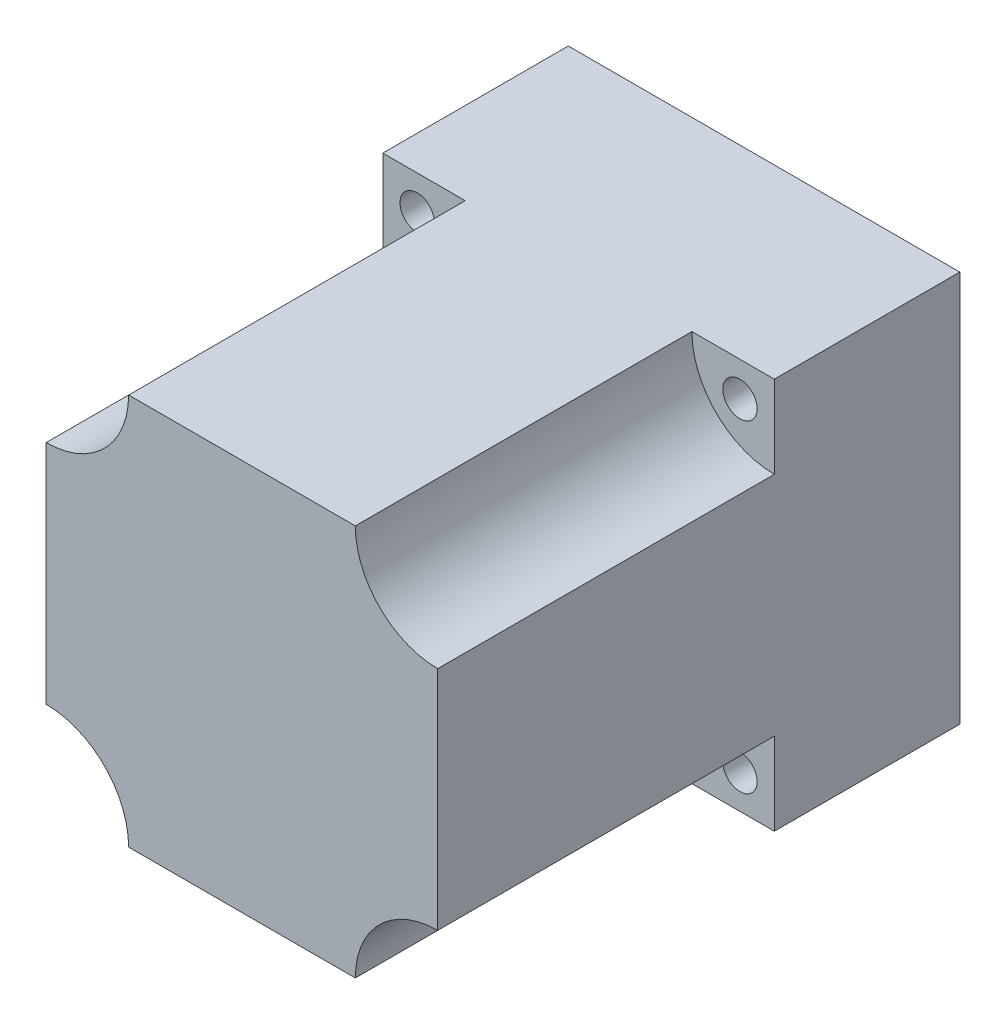
ISO-10303-21;
HEADER;
FILE_DESCRIPTION(('STEP AP214'),'2;1');
FILE_NAME('part.step','',(''),(''),'','','');
FILE_SCHEMA(('AUTOMOTIVE_DESIGN { 1 0 10303 214 1 1 1 1 }'));
ENDSEC;
DATA;
#1=APPLICATION_CONTEXT('core data for automotive mechanical design processes');
#2=APPLICATION_PROTOCOL_DEFINITION('international standard','automotive_design',2000,#1);
#3=PRODUCT_CONTEXT('',#1,'mechanical');
#4=PRODUCT('Part','Part','',(#3));
#5=PRODUCT_RELATED_PRODUCT_CATEGORY('part','',(#4));
#6=PRODUCT_DEFINITION_FORMATION('','',#4);
#7=PRODUCT_DEFINITION_CONTEXT('part definition',#1,'design');
#8=PRODUCT_DEFINITION('design','',#6,#7);
#9=PRODUCT_DEFINITION_SHAPE('','',#8);
#10=(LENGTH_UNIT() NAMED_UNIT(*) SI_UNIT(.MILLI.,.METRE.));
#11=(NAMED_UNIT(*) PLANE_ANGLE_UNIT() SI_UNIT($,.RADIAN.));
#12=(NAMED_UNIT(*) SI_UNIT($,.STERADIAN.) SOLID_ANGLE_UNIT());
#13=UNCERTAINTY_MEASURE_WITH_UNIT(LENGTH_MEASURE(1.E-05),#10,'distance_accuracy_value','');
#14=(GEOMETRIC_REPRESENTATION_CONTEXT(3) GLOBAL_UNCERTAINTY_ASSIGNED_CONTEXT((#13)) GLOBAL_UNIT_ASSIGNED_CONTEXT((#10,
#11,#12)) REPRESENTATION_CONTEXT('',''));
#15=CARTESIAN_POINT('',(0.,0.,0.));
#16=DIRECTION('',(0.,0.,1.));
#17=DIRECTION('',(1.,0.,0.));
#18=AXIS2_PLACEMENT_3D('',#15,#16,#17);
#19=CARTESIAN_POINT('',(28.5,28.5,76.));
#20=DIRECTION('',(-1.,0.,0.));
#21=DIRECTION('',(0.,-1.,0.));
#22=AXIS2_PLACEMENT_3D('',#19,#20,#21);
#23=PLANE('',#22);
#24=DIRECTION('',(0.,1.,0.));
#25=VECTOR('',#24,1.);
#26=CARTESIAN_POINT('',(28.5,28.5,27.));
#27=LINE('',#26,#25);
#28=CARTESIAN_POINT('',(28.5,16.5,27.));
#29=VERTEX_POINT('',#28);
#30=CARTESIAN_POINT('',(28.5,28.5,27.));
#31=VERTEX_POINT('',#30);
#32=EDGE_CURVE('E225',#29,#31,#27,.T.);
#33=ORIENTED_EDGE('',*,*,#32,.F.);
#34=DIRECTION('',(0.,0.,1.));
#35=VECTOR('',#34,1.);
#36=CARTESIAN_POINT('',(28.5,16.5,27.));
#37=LINE('',#36,#35);
#38=CARTESIAN_POINT('',(28.5,16.5,76.));
#39=VERTEX_POINT('',#38);
#40=EDGE_CURVE('E216',#29,#39,#37,.T.);
#41=ORIENTED_EDGE('',*,*,#40,.T.);
#42=DIRECTION('',(0.,1.,0.));
#43=VECTOR('',#42,1.);
#44=CARTESIAN_POINT('',(28.5,28.5,76.));
#45=LINE('',#44,#43);
#46=CARTESIAN_POINT('',(28.5,-16.5,76.));
#47=VERTEX_POINT('',#46);
#48=EDGE_CURVE('E228',#47,#39,#45,.T.);
#49=ORIENTED_EDGE('',*,*,#48,.F.);
#50=DIRECTION('',(0.,0.,1.));
#51=VECTOR('',#50,1.);
#52=CARTESIAN_POINT('',(28.5,-16.5,27.));
#53=LINE('',#52,#51);
#54=CARTESIAN_POINT('',(28.5,-16.5,27.));
#55=VERTEX_POINT('',#54);
#56=EDGE_CURVE('E206',#47,#55,#53,.F.);
#57=ORIENTED_EDGE('',*,*,#56,.T.);
#58=DIRECTION('',(0.,1.,0.));
#59=VECTOR('',#58,1.);
#60=CARTESIAN_POINT('',(28.5,28.5,27.));
#61=LINE('',#60,#59);
#62=CARTESIAN_POINT('',(28.5,-28.5,27.));
#63=VERTEX_POINT('',#62);
#64=EDGE_CURVE('E219',#63,#55,#61,.T.);
#65=ORIENTED_EDGE('',*,*,#64,.F.);
#66=DIRECTION('',(0.,0.,-1.));
#67=VECTOR('',#66,1.);
#68=CARTESIAN_POINT('',(28.5,-28.5,76.));
#69=LINE('',#68,#67);
#70=CARTESIAN_POINT('',(28.5,-28.5,0.));
#71=VERTEX_POINT('',#70);
#72=EDGE_CURVE('E241',#63,#71,#69,.T.);
#73=ORIENTED_EDGE('',*,*,#72,.T.);
#74=DIRECTION('',(0.,1.,0.));
#75=VECTOR('',#74,1.);
#76=CARTESIAN_POINT('',(28.5,28.5,0.));
#77=LINE('',#76,#75);
#78=CARTESIAN_POINT('',(28.5,28.5,0.));
#79=VERTEX_POINT('',#78);
#80=EDGE_CURVE('E227',#71,#79,#77,.T.);
#81=ORIENTED_EDGE('',*,*,#80,.T.);
#82=DIRECTION('',(0.,0.,-1.));
#83=VECTOR('',#82,1.);
#84=CARTESIAN_POINT('',(28.5,28.5,76.));
#85=LINE('',#84,#83);
#86=EDGE_CURVE('E257',#31,#79,#85,.T.);
#87=ORIENTED_EDGE('',*,*,#86,.F.);
#88=EDGE_LOOP('',(#33,#41,#49,#57,#65,#73,#81,#87));
#89=FACE_BOUND('',#88,.T.);
#90=ADVANCED_FACE('F39',(#89),#23,.F.);
#91=CARTESIAN_POINT('',(-28.5,28.5,76.));
#92=DIRECTION('',(0.,-1.,0.));
#93=DIRECTION('',(0.,0.,-1.));
#94=AXIS2_PLACEMENT_3D('',#91,#92,#93);
#95=PLANE('',#94);
#96=DIRECTION('',(-1.,0.,0.));
#97=VECTOR('',#96,1.);
#98=CARTESIAN_POINT('',(-28.5,28.5,76.));
#99=LINE('',#98,#97);
#100=CARTESIAN_POINT('',(16.5,28.5,76.));
#101=VERTEX_POINT('',#100);
#102=CARTESIAN_POINT('',(-16.5,28.5,76.));
#103=VERTEX_POINT('',#102);
#104=EDGE_CURVE('E231',#101,#103,#99,.T.);
#105=ORIENTED_EDGE('',*,*,#104,.F.);
#106=DIRECTION('',(0.,0.,1.));
#107=VECTOR('',#106,1.);
#108=CARTESIAN_POINT('',(16.5,28.5,27.));
#109=LINE('',#108,#107);
#110=CARTESIAN_POINT('',(16.5,28.5,27.));
#111=VERTEX_POINT('',#110);
#112=EDGE_CURVE('E213',#101,#111,#109,.F.);
#113=ORIENTED_EDGE('',*,*,#112,.T.);
#114=DIRECTION('',(-1.,0.,0.));
#115=VECTOR('',#114,1.);
#116=CARTESIAN_POINT('',(-28.5,28.5,27.));
#117=LINE('',#116,#115);
#118=EDGE_CURVE('E165',#31,#111,#117,.T.);
#119=ORIENTED_EDGE('',*,*,#118,.F.);
#120=ORIENTED_EDGE('',*,*,#86,.T.);
#121=DIRECTION('',(-1.,0.,0.));
#122=VECTOR('',#121,1.);
#123=CARTESIAN_POINT('',(-28.5,28.5,0.));
#124=LINE('',#123,#122);
#125=CARTESIAN_POINT('',(-28.5,28.5,0.));
#126=VERTEX_POINT('',#125);
#127=EDGE_CURVE('E244',#79,#126,#124,.T.);
#128=ORIENTED_EDGE('',*,*,#127,.T.);
#129=DIRECTION('',(0.,0.,-1.));
#130=VECTOR('',#129,1.);
#131=CARTESIAN_POINT('',(-28.5,28.5,76.));
#132=LINE('',#131,#130);
#133=CARTESIAN_POINT('',(-28.5,28.5,27.));
#134=VERTEX_POINT('',#133);
#135=EDGE_CURVE('E255',#134,#126,#132,.T.);
#136=ORIENTED_EDGE('',*,*,#135,.F.);
#137=DIRECTION('',(-1.,0.,0.));
#138=VECTOR('',#137,1.);
#139=CARTESIAN_POINT('',(-28.5,28.5,27.));
#140=LINE('',#139,#138);
#141=CARTESIAN_POINT('',(-16.5,28.5,27.));
#142=VERTEX_POINT('',#141);
#143=EDGE_CURVE('E223',#142,#134,#140,.T.);
#144=ORIENTED_EDGE('',*,*,#143,.F.);
#145=DIRECTION('',(0.,0.,1.));
#146=VECTOR('',#145,1.);
#147=CARTESIAN_POINT('',(-16.5,28.5,27.));
#148=LINE('',#147,#146);
#149=EDGE_CURVE('E200',#142,#103,#148,.T.);
#150=ORIENTED_EDGE('',*,*,#149,.T.);
#151=EDGE_LOOP('',(#105,#113,#119,#120,#128,#136,#144,#150));
#152=FACE_BOUND('',#151,.T.);
#153=ADVANCED_FACE('F298',(#152),#95,.F.);
#154=CARTESIAN_POINT('',(-28.5,28.5,76.));
#155=DIRECTION('',(1.,0.,0.));
#156=DIRECTION('',(0.,1.,0.));
#157=AXIS2_PLACEMENT_3D('',#154,#155,#156);
#158=PLANE('',#157);
#159=DIRECTION('',(0.,-1.,0.));
#160=VECTOR('',#159,1.);
#161=CARTESIAN_POINT('',(-28.5,28.5,27.));
#162=LINE('',#161,#160);
#163=CARTESIAN_POINT('',(-28.5,-16.5,27.));
#164=VERTEX_POINT('',#163);
#165=CARTESIAN_POINT('',(-28.5,-28.5,27.));
#166=VERTEX_POINT('',#165);
#167=EDGE_CURVE('E221',#164,#166,#162,.T.);
#168=ORIENTED_EDGE('',*,*,#167,.F.);
#169=DIRECTION('',(0.,0.,1.));
#170=VECTOR('',#169,1.);
#171=CARTESIAN_POINT('',(-28.5,-16.5,27.));
#172=LINE('',#171,#170);
#173=CARTESIAN_POINT('',(-28.5,-16.5,76.));
#174=VERTEX_POINT('',#173);
#175=EDGE_CURVE('E210',#164,#174,#172,.T.);
#176=ORIENTED_EDGE('',*,*,#175,.T.);
#177=DIRECTION('',(0.,-1.,0.));
#178=VECTOR('',#177,1.);
#179=CARTESIAN_POINT('',(-28.5,28.5,76.));
#180=LINE('',#179,#178);
#181=CARTESIAN_POINT('',(-28.5,16.5,76.));
#182=VERTEX_POINT('',#181);
#183=EDGE_CURVE('E235',#182,#174,#180,.T.);
#184=ORIENTED_EDGE('',*,*,#183,.F.);
#185=DIRECTION('',(0.,0.,1.));
#186=VECTOR('',#185,1.);
#187=CARTESIAN_POINT('',(-28.5,16.5,27.));
#188=LINE('',#187,#186);
#189=CARTESIAN_POINT('',(-28.5,16.5,27.));
#190=VERTEX_POINT('',#189);
#191=EDGE_CURVE('E197',#182,#190,#188,.F.);
#192=ORIENTED_EDGE('',*,*,#191,.T.);
#193=DIRECTION('',(0.,-1.,0.));
#194=VECTOR('',#193,1.);
#195=CARTESIAN_POINT('',(-28.5,28.5,27.));
#196=LINE('',#195,#194);
#197=EDGE_CURVE('E265',#134,#190,#196,.T.);
#198=ORIENTED_EDGE('',*,*,#197,.F.);
#199=ORIENTED_EDGE('',*,*,#135,.T.);
#200=DIRECTION('',(0.,-1.,0.));
#201=VECTOR('',#200,1.);
#202=CARTESIAN_POINT('',(-28.5,28.5,0.));
#203=LINE('',#202,#201);
#204=CARTESIAN_POINT('',(-28.5,-28.5,0.));
#205=VERTEX_POINT('',#204);
#206=EDGE_CURVE('E247',#126,#205,#203,.T.);
#207=ORIENTED_EDGE('',*,*,#206,.T.);
#208=DIRECTION('',(0.,0.,-1.));
#209=VECTOR('',#208,1.);
#210=CARTESIAN_POINT('',(-28.5,-28.5,76.));
#211=LINE('',#210,#209);
#212=EDGE_CURVE('E253',#166,#205,#211,.T.);
#213=ORIENTED_EDGE('',*,*,#212,.F.);
#214=EDGE_LOOP('',(#168,#176,#184,#192,#198,#199,#207,#213));
#215=FACE_BOUND('',#214,.T.);
#216=ADVANCED_FACE('F295',(#215),#158,.F.);
#217=CARTESIAN_POINT('',(-28.5,-28.5,76.));
#218=DIRECTION('',(0.,1.,0.));
#219=DIRECTION('',(0.,0.,1.));
#220=AXIS2_PLACEMENT_3D('',#217,#218,#219);
#221=PLANE('',#220);
#222=DIRECTION('',(1.,0.,0.));
#223=VECTOR('',#222,1.);
#224=CARTESIAN_POINT('',(-28.5,-28.5,76.));
#225=LINE('',#224,#223);
#226=CARTESIAN_POINT('',(-16.5,-28.5,76.));
#227=VERTEX_POINT('',#226);
#228=CARTESIAN_POINT('',(16.5,-28.5,76.));
#229=VERTEX_POINT('',#228);
#230=EDGE_CURVE('E238',#227,#229,#225,.T.);
#231=ORIENTED_EDGE('',*,*,#230,.F.);
#232=DIRECTION('',(0.,0.,1.));
#233=VECTOR('',#232,1.);
#234=CARTESIAN_POINT('',(-16.5,-28.5,27.));
#235=LINE('',#234,#233);
#236=CARTESIAN_POINT('',(-16.5,-28.5,27.));
#237=VERTEX_POINT('',#236);
#238=EDGE_CURVE('E61',#227,#237,#235,.F.);
#239=ORIENTED_EDGE('',*,*,#238,.T.);
#240=DIRECTION('',(1.,0.,0.));
#241=VECTOR('',#240,1.);
#242=CARTESIAN_POINT('',(-28.5,-28.5,27.));
#243=LINE('',#242,#241);
#244=EDGE_CURVE('E263',#166,#237,#243,.T.);
#245=ORIENTED_EDGE('',*,*,#244,.F.);
#246=ORIENTED_EDGE('',*,*,#212,.T.);
#247=DIRECTION('',(1.,0.,0.));
#248=VECTOR('',#247,1.);
#249=CARTESIAN_POINT('',(-28.5,-28.5,0.));
#250=LINE('',#249,#248);
#251=EDGE_CURVE('E232',#205,#71,#250,.T.);
#252=ORIENTED_EDGE('',*,*,#251,.T.);
#253=ORIENTED_EDGE('',*,*,#72,.F.);
#254=DIRECTION('',(1.,0.,0.));
#255=VECTOR('',#254,1.);
#256=CARTESIAN_POINT('',(-28.5,-28.5,27.));
#257=LINE('',#256,#255);
#258=CARTESIAN_POINT('',(16.5,-28.5,27.));
#259=VERTEX_POINT('',#258);
#260=EDGE_CURVE('E261',#259,#63,#257,.T.);
#261=ORIENTED_EDGE('',*,*,#260,.F.);
#262=DIRECTION('',(0.,0.,1.));
#263=VECTOR('',#262,1.);
#264=CARTESIAN_POINT('',(16.5,-28.5,27.));
#265=LINE('',#264,#263);
#266=EDGE_CURVE('E203',#259,#229,#265,.T.);
#267=ORIENTED_EDGE('',*,*,#266,.T.);
#268=EDGE_LOOP('',(#231,#239,#245,#246,#252,#253,#261,#267));
#269=FACE_BOUND('',#268,.T.);
#270=ADVANCED_FACE('F310',(#269),#221,.F.);
#271=CARTESIAN_POINT('',(0.,0.,76.));
#272=DIRECTION('',(0.,0.,1.));
#273=DIRECTION('',(1.,0.,0.));
#274=AXIS2_PLACEMENT_3D('',#271,#272,#273);
#275=PLANE('',#274);
#276=CARTESIAN_POINT('',(28.5,28.5,76.));
#277=DIRECTION('',(0.,0.,1.));
#278=DIRECTION('',(1.,0.,0.));
#279=AXIS2_PLACEMENT_3D('',#276,#277,#278);
#280=CIRCLE('',#279,12.);
#281=EDGE_CURVE('E185',#101,#39,#280,.T.);
#282=ORIENTED_EDGE('',*,*,#281,.F.);
#283=ORIENTED_EDGE('',*,*,#104,.T.);
#284=CARTESIAN_POINT('',(-28.5,28.5,76.));
#285=DIRECTION('',(0.,0.,1.));
#286=DIRECTION('',(1.,0.,0.));
#287=AXIS2_PLACEMENT_3D('',#284,#285,#286);
#288=CIRCLE('',#287,12.);
#289=EDGE_CURVE('E259',#182,#103,#288,.T.);
#290=ORIENTED_EDGE('',*,*,#289,.F.);
#291=ORIENTED_EDGE('',*,*,#183,.T.);
#292=CARTESIAN_POINT('',(-28.5,-28.5,76.));
#293=DIRECTION('',(0.,0.,1.));
#294=DIRECTION('',(1.,0.,0.));
#295=AXIS2_PLACEMENT_3D('',#292,#293,#294);
#296=CIRCLE('',#295,12.);
#297=EDGE_CURVE('E191',#227,#174,#296,.T.);
#298=ORIENTED_EDGE('',*,*,#297,.F.);
#299=ORIENTED_EDGE('',*,*,#230,.T.);
#300=CARTESIAN_POINT('',(28.5,-28.5,76.));
#301=DIRECTION('',(0.,0.,1.));
#302=DIRECTION('',(1.,0.,0.));
#303=AXIS2_PLACEMENT_3D('',#300,#301,#302);
#304=CIRCLE('',#303,12.);
#305=EDGE_CURVE('E178',#47,#229,#304,.T.);
#306=ORIENTED_EDGE('',*,*,#305,.F.);
#307=ORIENTED_EDGE('',*,*,#48,.T.);
#308=EDGE_LOOP('',(#282,#283,#290,#291,#298,#299,#306,#307));
#309=FACE_BOUND('',#308,.T.);
#310=ADVANCED_FACE('F318',(#309),#275,.T.);
#311=CARTESIAN_POINT('',(0.,0.,0.));
#312=DIRECTION('',(0.,0.,1.));
#313=DIRECTION('',(1.,0.,0.));
#314=AXIS2_PLACEMENT_3D('',#311,#312,#313);
#315=PLANE('',#314);
#316=CARTESIAN_POINT('',(0.,0.,0.));
#317=DIRECTION('',(0.,0.,-1.));
#318=DIRECTION('',(-1.,0.,0.));
#319=AXIS2_PLACEMENT_3D('',#316,#317,#318);
#320=CIRCLE('',#319,19.);
#321=CARTESIAN_POINT('',(-19.,0.,0.));
#322=VERTEX_POINT('',#321);
#323=EDGE_CURVE('E161',#322,#322,#320,.T.);
#324=ORIENTED_EDGE('',*,*,#323,.F.);
#325=EDGE_LOOP('',(#324));
#326=FACE_BOUND('',#325,.T.);
#327=CARTESIAN_POINT('',(-23.5,23.5,0.));
#328=DIRECTION('',(0.,0.,-1.));
#329=DIRECTION('',(-1.,0.,0.));
#330=AXIS2_PLACEMENT_3D('',#327,#328,#329);
#331=CIRCLE('',#330,2.5);
#332=CARTESIAN_POINT('',(-26.,23.5,0.));
#333=VERTEX_POINT('',#332);
#334=EDGE_CURVE('E169',#333,#333,#331,.T.);
#335=ORIENTED_EDGE('',*,*,#334,.F.);
#336=EDGE_LOOP('',(#335));
#337=FACE_BOUND('',#336,.T.);
#338=CARTESIAN_POINT('',(23.5,-23.5,0.));
#339=DIRECTION('',(0.,0.,-1.));
#340=DIRECTION('',(-1.,0.,0.));
#341=AXIS2_PLACEMENT_3D('',#338,#339,#340);
#342=CIRCLE('',#341,2.5);
#343=CARTESIAN_POINT('',(21.,-23.5,0.));
#344=VERTEX_POINT('',#343);
#345=EDGE_CURVE('E168',#344,#344,#342,.T.);
#346=ORIENTED_EDGE('',*,*,#345,.F.);
#347=EDGE_LOOP('',(#346));
#348=FACE_BOUND('',#347,.T.);
#349=CARTESIAN_POINT('',(-23.5,-23.5,0.));
#350=DIRECTION('',(0.,0.,-1.));
#351=DIRECTION('',(-1.,0.,0.));
#352=AXIS2_PLACEMENT_3D('',#349,#350,#351);
#353=CIRCLE('',#352,2.5);
#354=CARTESIAN_POINT('',(-26.,-23.5,0.));
#355=VERTEX_POINT('',#354);
#356=EDGE_CURVE('E156',#355,#355,#353,.T.);
#357=ORIENTED_EDGE('',*,*,#356,.F.);
#358=EDGE_LOOP('',(#357));
#359=FACE_BOUND('',#358,.T.);
#360=CARTESIAN_POINT('',(23.5,23.5,0.));
#361=DIRECTION('',(0.,0.,-1.));
#362=DIRECTION('',(-1.,0.,0.));
#363=AXIS2_PLACEMENT_3D('',#360,#361,#362);
#364=CIRCLE('',#363,2.5);
#365=CARTESIAN_POINT('',(21.,23.5,0.));
#366=VERTEX_POINT('',#365);
#367=EDGE_CURVE('E172',#366,#366,#364,.T.);
#368=ORIENTED_EDGE('',*,*,#367,.F.);
#369=EDGE_LOOP('',(#368));
#370=FACE_BOUND('',#369,.T.);
#371=ORIENTED_EDGE('',*,*,#80,.F.);
#372=ORIENTED_EDGE('',*,*,#251,.F.);
#373=ORIENTED_EDGE('',*,*,#206,.F.);
#374=ORIENTED_EDGE('',*,*,#127,.F.);
#375=EDGE_LOOP('',(#371,#372,#373,#374));
#376=FACE_BOUND('',#375,.T.);
#377=ADVANCED_FACE('F286',(#326,#337,#348,#359,#370,#376),#315,.F.);
#378=CARTESIAN_POINT('',(-28.5,28.5,27.));
#379=DIRECTION('',(0.,0.,1.));
#380=DIRECTION('',(1.,0.,0.));
#381=AXIS2_PLACEMENT_3D('',#378,#379,#380);
#382=PLANE('',#381);
#383=CARTESIAN_POINT('',(-23.5,23.5,27.));
#384=DIRECTION('',(0.,0.,1.));
#385=DIRECTION('',(1.,0.,0.));
#386=AXIS2_PLACEMENT_3D('',#383,#384,#385);
#387=CIRCLE('',#386,2.5);
#388=CARTESIAN_POINT('',(-21.,23.5,27.));
#389=VERTEX_POINT('',#388);
#390=EDGE_CURVE('E184',#389,#389,#387,.T.);
#391=ORIENTED_EDGE('',*,*,#390,.F.);
#392=EDGE_LOOP('',(#391));
#393=FACE_BOUND('',#392,.T.);
#394=ORIENTED_EDGE('',*,*,#143,.T.);
#395=ORIENTED_EDGE('',*,*,#197,.T.);
#396=CARTESIAN_POINT('',(-28.5,28.5,27.));
#397=DIRECTION('',(0.,0.,1.));
#398=DIRECTION('',(1.,0.,0.));
#399=AXIS2_PLACEMENT_3D('',#396,#397,#398);
#400=CIRCLE('',#399,12.);
#401=EDGE_CURVE('E187',#190,#142,#400,.T.);
#402=ORIENTED_EDGE('',*,*,#401,.T.);
#403=EDGE_LOOP('',(#394,#395,#402));
#404=FACE_BOUND('',#403,.T.);
#405=ADVANCED_FACE('F282',(#393,#404),#382,.T.);
#406=CARTESIAN_POINT('',(-28.5,28.5,27.));
#407=DIRECTION('',(0.,0.,1.));
#408=DIRECTION('',(1.,0.,0.));
#409=AXIS2_PLACEMENT_3D('',#406,#407,#408);
#410=CYLINDRICAL_SURFACE('',#409,12.);
#411=ORIENTED_EDGE('',*,*,#401,.F.);
#412=ORIENTED_EDGE('',*,*,#191,.F.);
#413=ORIENTED_EDGE('',*,*,#289,.T.);
#414=ORIENTED_EDGE('',*,*,#149,.F.);
#415=EDGE_LOOP('',(#411,#412,#413,#414));
#416=FACE_BOUND('',#415,.T.);
#417=ADVANCED_FACE('F285',(#416),#410,.F.);
#418=CARTESIAN_POINT('',(28.5,-28.5,27.));
#419=DIRECTION('',(0.,0.,1.));
#420=DIRECTION('',(1.,0.,0.));
#421=AXIS2_PLACEMENT_3D('',#418,#419,#420);
#422=PLANE('',#421);
#423=CARTESIAN_POINT('',(23.5,-23.5,27.));
#424=DIRECTION('',(0.,0.,1.));
#425=DIRECTION('',(1.,0.,0.));
#426=AXIS2_PLACEMENT_3D('',#423,#424,#425);
#427=CIRCLE('',#426,2.5);
#428=CARTESIAN_POINT('',(26.,-23.5,27.));
#429=VERTEX_POINT('',#428);
#430=EDGE_CURVE('E273',#429,#429,#427,.T.);
#431=ORIENTED_EDGE('',*,*,#430,.F.);
#432=EDGE_LOOP('',(#431));
#433=FACE_BOUND('',#432,.T.);
#434=ORIENTED_EDGE('',*,*,#64,.T.);
#435=CARTESIAN_POINT('',(28.5,-28.5,27.));
#436=DIRECTION('',(0.,0.,1.));
#437=DIRECTION('',(1.,0.,0.));
#438=AXIS2_PLACEMENT_3D('',#435,#436,#437);
#439=CIRCLE('',#438,12.);
#440=EDGE_CURVE('E181',#55,#259,#439,.T.);
#441=ORIENTED_EDGE('',*,*,#440,.T.);
#442=ORIENTED_EDGE('',*,*,#260,.T.);
#443=EDGE_LOOP('',(#434,#441,#442));
#444=FACE_BOUND('',#443,.T.);
#445=ADVANCED_FACE('F358',(#433,#444),#422,.T.);
#446=CARTESIAN_POINT('',(28.5,-28.5,27.));
#447=DIRECTION('',(0.,0.,1.));
#448=DIRECTION('',(1.,0.,0.));
#449=AXIS2_PLACEMENT_3D('',#446,#447,#448);
#450=CYLINDRICAL_SURFACE('',#449,12.);
#451=ORIENTED_EDGE('',*,*,#305,.T.);
#452=ORIENTED_EDGE('',*,*,#266,.F.);
#453=ORIENTED_EDGE('',*,*,#440,.F.);
#454=ORIENTED_EDGE('',*,*,#56,.F.);
#455=EDGE_LOOP('',(#451,#452,#453,#454));
#456=FACE_BOUND('',#455,.T.);
#457=ADVANCED_FACE('F361',(#456),#450,.F.);
#458=CARTESIAN_POINT('',(-28.5,-28.5,27.));
#459=DIRECTION('',(0.,0.,1.));
#460=DIRECTION('',(1.,0.,0.));
#461=AXIS2_PLACEMENT_3D('',#458,#459,#460);
#462=PLANE('',#461);
#463=CARTESIAN_POINT('',(-23.5,-23.5,27.));
#464=DIRECTION('',(0.,0.,1.));
#465=DIRECTION('',(1.,0.,0.));
#466=AXIS2_PLACEMENT_3D('',#463,#464,#465);
#467=CIRCLE('',#466,2.5);
#468=CARTESIAN_POINT('',(-21.,-23.5,27.));
#469=VERTEX_POINT('',#468);
#470=EDGE_CURVE('E270',#469,#469,#467,.T.);
#471=ORIENTED_EDGE('',*,*,#470,.F.);
#472=EDGE_LOOP('',(#471));
#473=FACE_BOUND('',#472,.T.);
#474=ORIENTED_EDGE('',*,*,#167,.T.);
#475=ORIENTED_EDGE('',*,*,#244,.T.);
#476=CARTESIAN_POINT('',(-28.5,-28.5,27.));
#477=DIRECTION('',(0.,0.,1.));
#478=DIRECTION('',(1.,0.,0.));
#479=AXIS2_PLACEMENT_3D('',#476,#477,#478);
#480=CIRCLE('',#479,12.);
#481=EDGE_CURVE('E180',#237,#164,#480,.T.);
#482=ORIENTED_EDGE('',*,*,#481,.T.);
#483=EDGE_LOOP('',(#474,#475,#482));
#484=FACE_BOUND('',#483,.T.);
#485=ADVANCED_FACE('F313',(#473,#484),#462,.T.);
#486=CARTESIAN_POINT('',(-28.5,-28.5,27.));
#487=DIRECTION('',(0.,0.,1.));
#488=DIRECTION('',(1.,0.,0.));
#489=AXIS2_PLACEMENT_3D('',#486,#487,#488);
#490=CYLINDRICAL_SURFACE('',#489,12.);
#491=ORIENTED_EDGE('',*,*,#481,.F.);
#492=ORIENTED_EDGE('',*,*,#238,.F.);
#493=ORIENTED_EDGE('',*,*,#297,.T.);
#494=ORIENTED_EDGE('',*,*,#175,.F.);
#495=EDGE_LOOP('',(#491,#492,#493,#494));
#496=FACE_BOUND('',#495,.T.);
#497=ADVANCED_FACE('F314',(#496),#490,.F.);
#498=CARTESIAN_POINT('',(28.5,28.5,27.));
#499=DIRECTION('',(0.,0.,1.));
#500=DIRECTION('',(1.,0.,0.));
#501=AXIS2_PLACEMENT_3D('',#498,#499,#500);
#502=PLANE('',#501);
#503=CARTESIAN_POINT('',(23.5,23.5,27.));
#504=DIRECTION('',(0.,0.,1.));
#505=DIRECTION('',(1.,0.,0.));
#506=AXIS2_PLACEMENT_3D('',#503,#504,#505);
#507=CIRCLE('',#506,2.5);
#508=CARTESIAN_POINT('',(26.,23.5,27.));
#509=VERTEX_POINT('',#508);
#510=EDGE_CURVE('E177',#509,#509,#507,.T.);
#511=ORIENTED_EDGE('',*,*,#510,.F.);
#512=EDGE_LOOP('',(#511));
#513=FACE_BOUND('',#512,.T.);
#514=ORIENTED_EDGE('',*,*,#32,.T.);
#515=ORIENTED_EDGE('',*,*,#118,.T.);
#516=CARTESIAN_POINT('',(28.5,28.5,27.));
#517=DIRECTION('',(0.,0.,1.));
#518=DIRECTION('',(1.,0.,0.));
#519=AXIS2_PLACEMENT_3D('',#516,#517,#518);
#520=CIRCLE('',#519,12.);
#521=EDGE_CURVE('E188',#111,#29,#520,.T.);
#522=ORIENTED_EDGE('',*,*,#521,.T.);
#523=EDGE_LOOP('',(#514,#515,#522));
#524=FACE_BOUND('',#523,.T.);
#525=ADVANCED_FACE('F329',(#513,#524),#502,.T.);
#526=CARTESIAN_POINT('',(28.5,28.5,27.));
#527=DIRECTION('',(0.,0.,1.));
#528=DIRECTION('',(1.,0.,0.));
#529=AXIS2_PLACEMENT_3D('',#526,#527,#528);
#530=CYLINDRICAL_SURFACE('',#529,12.);
#531=ORIENTED_EDGE('',*,*,#521,.F.);
#532=ORIENTED_EDGE('',*,*,#112,.F.);
#533=ORIENTED_EDGE('',*,*,#281,.T.);
#534=ORIENTED_EDGE('',*,*,#40,.F.);
#535=EDGE_LOOP('',(#531,#532,#533,#534));
#536=FACE_BOUND('',#535,.T.);
#537=ADVANCED_FACE('F322',(#536),#530,.F.);
#538=CARTESIAN_POINT('',(23.5,23.5,76.));
#539=DIRECTION('',(0.,0.,-1.));
#540=DIRECTION('',(-1.,0.,0.));
#541=AXIS2_PLACEMENT_3D('',#538,#539,#540);
#542=CYLINDRICAL_SURFACE('',#541,2.5);
#543=ORIENTED_EDGE('',*,*,#510,.T.);
#544=EDGE_LOOP('',(#543));
#545=FACE_BOUND('',#544,.T.);
#546=ORIENTED_EDGE('',*,*,#367,.T.);
#547=EDGE_LOOP('',(#546));
#548=FACE_BOUND('',#547,.T.);
#549=ADVANCED_FACE('F337',(#545,#548),#542,.F.);
#550=CARTESIAN_POINT('',(-23.5,-23.5,76.));
#551=DIRECTION('',(0.,0.,-1.));
#552=DIRECTION('',(-1.,0.,0.));
#553=AXIS2_PLACEMENT_3D('',#550,#551,#552);
#554=CYLINDRICAL_SURFACE('',#553,2.5);
#555=ORIENTED_EDGE('',*,*,#470,.T.);
#556=EDGE_LOOP('',(#555));
#557=FACE_BOUND('',#556,.T.);
#558=ORIENTED_EDGE('',*,*,#356,.T.);
#559=EDGE_LOOP('',(#558));
#560=FACE_BOUND('',#559,.T.);
#561=ADVANCED_FACE('F370',(#557,#560),#554,.F.);
#562=CARTESIAN_POINT('',(23.5,-23.5,76.));
#563=DIRECTION('',(0.,0.,-1.));
#564=DIRECTION('',(-1.,0.,0.));
#565=AXIS2_PLACEMENT_3D('',#562,#563,#564);
#566=CYLINDRICAL_SURFACE('',#565,2.5);
#567=ORIENTED_EDGE('',*,*,#430,.T.);
#568=EDGE_LOOP('',(#567));
#569=FACE_BOUND('',#568,.T.);
#570=ORIENTED_EDGE('',*,*,#345,.T.);
#571=EDGE_LOOP('',(#570));
#572=FACE_BOUND('',#571,.T.);
#573=ADVANCED_FACE('F373',(#569,#572),#566,.F.);
#574=CARTESIAN_POINT('',(-23.5,23.5,76.));
#575=DIRECTION('',(0.,0.,-1.));
#576=DIRECTION('',(-1.,0.,0.));
#577=AXIS2_PLACEMENT_3D('',#574,#575,#576);
#578=CYLINDRICAL_SURFACE('',#577,2.5);
#579=ORIENTED_EDGE('',*,*,#390,.T.);
#580=EDGE_LOOP('',(#579));
#581=FACE_BOUND('',#580,.T.);
#582=ORIENTED_EDGE('',*,*,#334,.T.);
#583=EDGE_LOOP('',(#582));
#584=FACE_BOUND('',#583,.T.);
#585=ADVANCED_FACE('F279',(#581,#584),#578,.F.);
#586=CARTESIAN_POINT('',(0.,0.,-1.6));
#587=DIRECTION('',(0.,0.,1.));
#588=DIRECTION('',(1.,0.,0.));
#589=AXIS2_PLACEMENT_3D('',#586,#587,#588);
#590=CYLINDRICAL_SURFACE('',#589,19.);
#591=CARTESIAN_POINT('',(0.,0.,-1.6));
#592=DIRECTION('',(0.,0.,-1.));
#593=DIRECTION('',(-1.,0.,0.));
#594=AXIS2_PLACEMENT_3D('',#591,#592,#593);
#595=CIRCLE('',#594,19.);
#596=CARTESIAN_POINT('',(-19.,0.,-1.6));
#597=VERTEX_POINT('',#596);
#598=EDGE_CURVE('E153',#597,#597,#595,.T.);
#599=ORIENTED_EDGE('',*,*,#598,.F.);
#600=EDGE_LOOP('',(#599));
#601=FACE_BOUND('',#600,.T.);
#602=ORIENTED_EDGE('',*,*,#323,.T.);
#603=EDGE_LOOP('',(#602));
#604=FACE_BOUND('',#603,.T.);
#605=ADVANCED_FACE('F404',(#601,#604),#590,.T.);
#606=CARTESIAN_POINT('',(0.,0.,-1.6));
#607=DIRECTION('',(0.,0.,-1.));
#608=DIRECTION('',(-1.,0.,0.));
#609=AXIS2_PLACEMENT_3D('',#606,#607,#608);
#610=PLANE('',#609);
#611=CARTESIAN_POINT('',(0.,0.,-1.6));
#612=DIRECTION('',(0.,0.,-1.));
#613=DIRECTION('',(-1.,0.,0.));
#614=AXIS2_PLACEMENT_3D('',#611,#612,#613);
#615=CIRCLE('',#614,4.);
#616=CARTESIAN_POINT('',(-4.,0.,-1.6));
#617=VERTEX_POINT('',#616);
#618=EDGE_CURVE('E144',#617,#617,#615,.T.);
#619=ORIENTED_EDGE('',*,*,#618,.F.);
#620=EDGE_LOOP('',(#619));
#621=FACE_BOUND('',#620,.T.);
#622=ORIENTED_EDGE('',*,*,#598,.T.);
#623=EDGE_LOOP('',(#622));
#624=FACE_BOUND('',#623,.T.);
#625=ADVANCED_FACE('F408',(#621,#624),#610,.T.);
#626=CARTESIAN_POINT('',(0.,0.,-20.));
#627=DIRECTION('',(0.,0.,1.));
#628=DIRECTION('',(1.,0.,0.));
#629=AXIS2_PLACEMENT_3D('',#626,#627,#628);
#630=CYLINDRICAL_SURFACE('',#629,4.);
#631=CARTESIAN_POINT('',(0.,0.,-20.));
#632=DIRECTION('',(0.,0.,-1.));
#633=DIRECTION('',(-1.,0.,0.));
#634=AXIS2_PLACEMENT_3D('',#631,#632,#633);
#635=CIRCLE('',#634,4.);
#636=CARTESIAN_POINT('',(1.93649167310371,3.5,-20.));
#637=VERTEX_POINT('',#636);
#638=CARTESIAN_POINT('',(-1.93649167310371,3.5,-20.));
#639=VERTEX_POINT('',#638);
#640=EDGE_CURVE('E149',#637,#639,#635,.T.);
#641=ORIENTED_EDGE('',*,*,#640,.F.);
#642=DIRECTION('',(0.,0.,1.));
#643=VECTOR('',#642,1.);
#644=CARTESIAN_POINT('',(1.93649167310371,3.5,-20.));
#645=LINE('',#644,#643);
#646=CARTESIAN_POINT('',(1.93649167310371,3.5,-5.));
#647=VERTEX_POINT('',#646);
#648=EDGE_CURVE('E53',#637,#647,#645,.T.);
#649=ORIENTED_EDGE('',*,*,#648,.T.);
#650=CARTESIAN_POINT('',(0.,0.,-5.));
#651=DIRECTION('',(0.,0.,-1.));
#652=DIRECTION('',(-1.,0.,0.));
#653=AXIS2_PLACEMENT_3D('',#650,#651,#652);
#654=CIRCLE('',#653,4.);
#655=CARTESIAN_POINT('',(-1.93649167310371,3.5,-5.));
#656=VERTEX_POINT('',#655);
#657=EDGE_CURVE('E11',#656,#647,#654,.T.);
#658=ORIENTED_EDGE('',*,*,#657,.F.);
#659=DIRECTION('',(0.,0.,1.));
#660=VECTOR('',#659,1.);
#661=CARTESIAN_POINT('',(-1.93649167310371,3.5,-20.));
#662=LINE('',#661,#660);
#663=EDGE_CURVE('E139',#656,#639,#662,.F.);
#664=ORIENTED_EDGE('',*,*,#663,.T.);
#665=EDGE_LOOP('',(#641,#649,#658,#664));
#666=FACE_BOUND('',#665,.T.);
#667=ORIENTED_EDGE('',*,*,#618,.T.);
#668=EDGE_LOOP('',(#667));
#669=FACE_BOUND('',#668,.T.);
#670=ADVANCED_FACE('F147',(#666,#669),#630,.T.);
#671=CARTESIAN_POINT('',(0.,0.,-20.));
#672=DIRECTION('',(0.,0.,-1.));
#673=DIRECTION('',(-1.,0.,0.));
#674=AXIS2_PLACEMENT_3D('',#671,#672,#673);
#675=PLANE('',#674);
#676=DIRECTION('',(-1.,0.,0.));
#677=VECTOR('',#676,1.);
#678=CARTESIAN_POINT('',(0.,3.5,-20.));
#679=LINE('',#678,#677);
#680=EDGE_CURVE('E46',#637,#639,#679,.T.);
#681=ORIENTED_EDGE('',*,*,#680,.F.);
#682=ORIENTED_EDGE('',*,*,#640,.T.);
#683=EDGE_LOOP('',(#681,#682));
#684=FACE_BOUND('',#683,.T.);
#685=ADVANCED_FACE('F152',(#684),#675,.T.);
#686=CARTESIAN_POINT('',(0.,0.,-5.));
#687=DIRECTION('',(0.,0.,-1.));
#688=DIRECTION('',(-1.,0.,0.));
#689=AXIS2_PLACEMENT_3D('',#686,#687,#688);
#690=PLANE('',#689);
#691=ORIENTED_EDGE('',*,*,#657,.T.);
#692=DIRECTION('',(-1.,0.,0.));
#693=VECTOR('',#692,1.);
#694=CARTESIAN_POINT('',(6.51734994178628,3.5,-5.));
#695=LINE('',#694,#693);
#696=EDGE_CURVE('E150',#647,#656,#695,.T.);
#697=ORIENTED_EDGE('',*,*,#696,.T.);
#698=EDGE_LOOP('',(#691,#697));
#699=FACE_BOUND('',#698,.T.);
#700=ADVANCED_FACE('F419',(#699),#690,.T.);
#701=CARTESIAN_POINT('',(6.51734994178628,3.5,-5.));
#702=DIRECTION('',(0.,-1.,0.));
#703=DIRECTION('',(1.,0.,0.));
#704=AXIS2_PLACEMENT_3D('',#701,#702,#703);
#705=PLANE('',#704);
#706=ORIENTED_EDGE('',*,*,#680,.T.);
#707=ORIENTED_EDGE('',*,*,#663,.F.);
#708=ORIENTED_EDGE('',*,*,#696,.F.);
#709=ORIENTED_EDGE('',*,*,#648,.F.);
#710=EDGE_LOOP('',(#706,#707,#708,#709));
#711=FACE_BOUND('',#710,.T.);
#712=ADVANCED_FACE('F138',(#711),#705,.F.);
#713=CLOSED_SHELL('',(#90,#153,#216,#270,#310,#377,#405,#417,#445,#457,#485,#497,#525,#537,#549,
#561,#573,#585,#605,#625,#670,#685,#700,#712));
#714=MANIFOLD_SOLID_BREP('B2',#713);
#715=ADVANCED_BREP_SHAPE_REPRESENTATION('',(#18,#714),#14);
#716=SHAPE_DEFINITION_REPRESENTATION(#9,#715);
ENDSEC;
END-ISO-10303-21;
